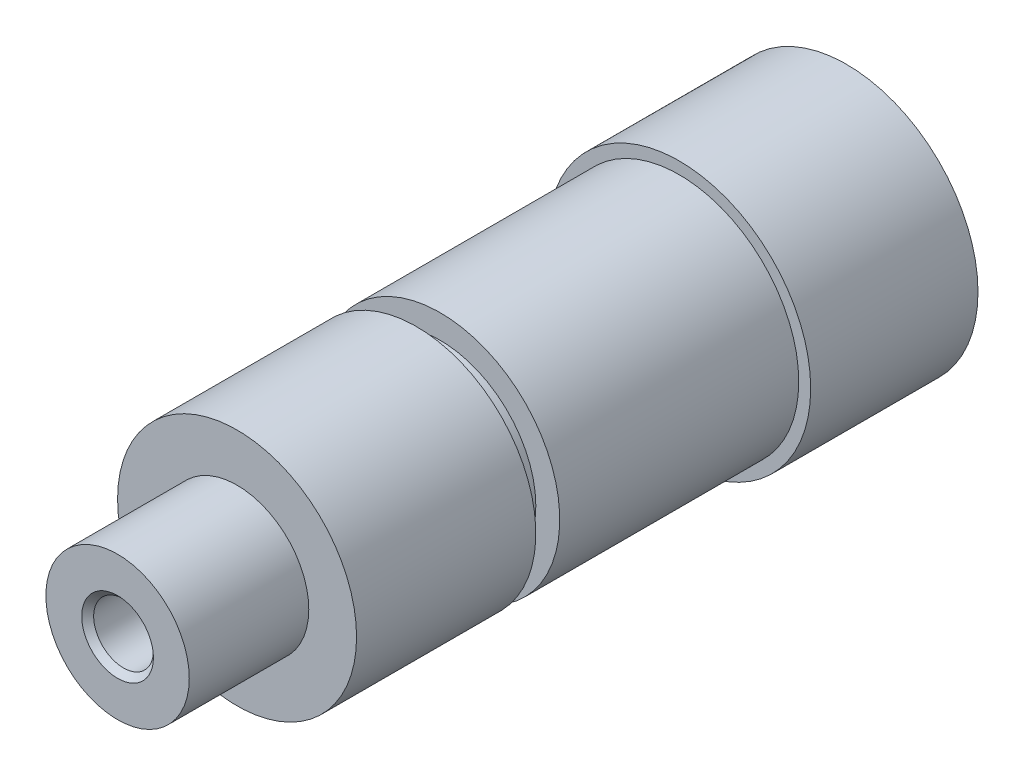
ISO-10303-21;
HEADER;
FILE_DESCRIPTION(('STEP AP214'),'2;1');
FILE_NAME('part.step','',(''),(''),'','','');
FILE_SCHEMA(('AUTOMOTIVE_DESIGN { 1 0 10303 214 1 1 1 1 }'));
ENDSEC;
DATA;
#1=APPLICATION_CONTEXT('core data for automotive mechanical design processes');
#2=APPLICATION_PROTOCOL_DEFINITION('international standard','automotive_design',2000,#1);
#3=PRODUCT_CONTEXT('',#1,'mechanical');
#4=PRODUCT('Part','Part','',(#3));
#5=PRODUCT_RELATED_PRODUCT_CATEGORY('part','',(#4));
#6=PRODUCT_DEFINITION_FORMATION('','',#4);
#7=PRODUCT_DEFINITION_CONTEXT('part definition',#1,'design');
#8=PRODUCT_DEFINITION('design','',#6,#7);
#9=PRODUCT_DEFINITION_SHAPE('','',#8);
#10=(LENGTH_UNIT() NAMED_UNIT(*) SI_UNIT(.MILLI.,.METRE.));
#11=(NAMED_UNIT(*) PLANE_ANGLE_UNIT() SI_UNIT($,.RADIAN.));
#12=(NAMED_UNIT(*) SI_UNIT($,.STERADIAN.) SOLID_ANGLE_UNIT());
#13=UNCERTAINTY_MEASURE_WITH_UNIT(LENGTH_MEASURE(1.E-05),#10,'distance_accuracy_value','');
#14=(GEOMETRIC_REPRESENTATION_CONTEXT(3) GLOBAL_UNCERTAINTY_ASSIGNED_CONTEXT((#13)) GLOBAL_UNIT_ASSIGNED_CONTEXT((#10,
#11,#12)) REPRESENTATION_CONTEXT('',''));
#15=CARTESIAN_POINT('',(0.,0.,0.));
#16=DIRECTION('',(0.,0.,1.));
#17=DIRECTION('',(1.,0.,0.));
#18=AXIS2_PLACEMENT_3D('',#15,#16,#17);
#19=CARTESIAN_POINT('',(0.,0.,51.));
#20=DIRECTION('',(0.,0.,1.));
#21=DIRECTION('',(1.,0.,0.));
#22=AXIS2_PLACEMENT_3D('',#19,#20,#21);
#23=PLANE('',#22);
#24=CARTESIAN_POINT('',(0.,0.,51.));
#25=DIRECTION('',(0.,0.,1.));
#26=DIRECTION('',(1.,0.,0.));
#27=AXIS2_PLACEMENT_3D('',#24,#25,#26);
#28=CIRCLE('',#27,10.);
#29=CARTESIAN_POINT('',(10.,0.,51.));
#30=VERTEX_POINT('',#29);
#31=EDGE_CURVE('E85',#30,#30,#28,.T.);
#32=ORIENTED_EDGE('',*,*,#31,.T.);
#33=EDGE_LOOP('',(#32));
#34=FACE_BOUND('',#33,.T.);
#35=CARTESIAN_POINT('',(0.,0.,51.));
#36=DIRECTION('',(0.,0.,1.));
#37=DIRECTION('',(1.,0.,0.));
#38=AXIS2_PLACEMENT_3D('',#35,#36,#37);
#39=CIRCLE('',#38,6.);
#40=CARTESIAN_POINT('',(6.,0.,51.));
#41=VERTEX_POINT('',#40);
#42=EDGE_CURVE('E64',#41,#41,#39,.T.);
#43=ORIENTED_EDGE('',*,*,#42,.F.);
#44=EDGE_LOOP('',(#43));
#45=FACE_BOUND('',#44,.T.);
#46=ADVANCED_FACE('F37',(#34,#45),#23,.T.);
#47=CARTESIAN_POINT('',(0.,0.,51.));
#48=DIRECTION('',(0.,0.,-1.));
#49=DIRECTION('',(-1.,0.,0.));
#50=AXIS2_PLACEMENT_3D('',#47,#48,#49);
#51=CYLINDRICAL_SURFACE('',#50,10.);
#52=CARTESIAN_POINT('',(0.,0.,14.));
#53=DIRECTION('',(0.,0.,1.));
#54=DIRECTION('',(1.,0.,0.));
#55=AXIS2_PLACEMENT_3D('',#52,#53,#54);
#56=CIRCLE('',#55,10.);
#57=CARTESIAN_POINT('',(10.,0.,14.));
#58=VERTEX_POINT('',#57);
#59=EDGE_CURVE('E82',#58,#58,#56,.T.);
#60=ORIENTED_EDGE('',*,*,#59,.T.);
#61=EDGE_LOOP('',(#60));
#62=FACE_BOUND('',#61,.T.);
#63=CARTESIAN_POINT('',(0.,0.,34.));
#64=DIRECTION('',(0.,0.,-1.));
#65=DIRECTION('',(-1.,0.,0.));
#66=AXIS2_PLACEMENT_3D('',#63,#64,#65);
#67=CIRCLE('',#66,10.);
#68=CARTESIAN_POINT('',(-10.,0.,34.));
#69=VERTEX_POINT('',#68);
#70=EDGE_CURVE('E79',#69,#69,#67,.T.);
#71=ORIENTED_EDGE('',*,*,#70,.T.);
#72=EDGE_LOOP('',(#71));
#73=FACE_BOUND('',#72,.T.);
#74=ADVANCED_FACE('F107',(#62,#73),#51,.T.);
#75=CARTESIAN_POINT('',(0.,0.,14.));
#76=DIRECTION('',(0.,0.,1.));
#77=DIRECTION('',(1.,0.,0.));
#78=AXIS2_PLACEMENT_3D('',#75,#76,#77);
#79=PLANE('',#78);
#80=CARTESIAN_POINT('',(0.,0.,14.));
#81=DIRECTION('',(0.,0.,1.));
#82=DIRECTION('',(1.,0.,0.));
#83=AXIS2_PLACEMENT_3D('',#80,#81,#82);
#84=CIRCLE('',#83,11.);
#85=CARTESIAN_POINT('',(11.,0.,14.));
#86=VERTEX_POINT('',#85);
#87=EDGE_CURVE('E11',#86,#86,#84,.T.);
#88=ORIENTED_EDGE('',*,*,#87,.T.);
#89=EDGE_LOOP('',(#88));
#90=FACE_BOUND('',#89,.T.);
#91=ORIENTED_EDGE('',*,*,#59,.F.);
#92=EDGE_LOOP('',(#91));
#93=FACE_BOUND('',#92,.T.);
#94=ADVANCED_FACE('F103',(#90,#93),#79,.T.);
#95=CARTESIAN_POINT('',(0.,0.,14.));
#96=DIRECTION('',(0.,0.,-1.));
#97=DIRECTION('',(-1.,0.,0.));
#98=AXIS2_PLACEMENT_3D('',#95,#96,#97);
#99=CYLINDRICAL_SURFACE('',#98,11.);
#100=ORIENTED_EDGE('',*,*,#87,.F.);
#101=EDGE_LOOP('',(#100));
#102=FACE_BOUND('',#101,.T.);
#103=CARTESIAN_POINT('',(0.,0.,0.));
#104=DIRECTION('',(0.,0.,1.));
#105=DIRECTION('',(1.,0.,0.));
#106=AXIS2_PLACEMENT_3D('',#103,#104,#105);
#107=CIRCLE('',#106,11.);
#108=CARTESIAN_POINT('',(11.,0.,0.));
#109=VERTEX_POINT('',#108);
#110=EDGE_CURVE('E44',#109,#109,#107,.T.);
#111=ORIENTED_EDGE('',*,*,#110,.T.);
#112=EDGE_LOOP('',(#111));
#113=FACE_BOUND('',#112,.T.);
#114=ADVANCED_FACE('F39',(#102,#113),#99,.T.);
#115=CARTESIAN_POINT('',(0.,0.,0.));
#116=DIRECTION('',(0.,0.,1.));
#117=DIRECTION('',(1.,0.,0.));
#118=AXIS2_PLACEMENT_3D('',#115,#116,#117);
#119=PLANE('',#118);
#120=ORIENTED_EDGE('',*,*,#110,.F.);
#121=EDGE_LOOP('',(#120));
#122=FACE_BOUND('',#121,.T.);
#123=ADVANCED_FACE('F92',(#122),#119,.F.);
#124=CARTESIAN_POINT('',(10.,0.,34.));
#125=DIRECTION('',(0.,0.,1.));
#126=DIRECTION('',(1.,0.,0.));
#127=AXIS2_PLACEMENT_3D('',#124,#125,#126);
#128=PLANE('',#127);
#129=CARTESIAN_POINT('',(0.,0.,34.));
#130=DIRECTION('',(0.,0.,-1.));
#131=DIRECTION('',(-1.,0.,0.));
#132=AXIS2_PLACEMENT_3D('',#129,#130,#131);
#133=CIRCLE('',#132,8.);
#134=CARTESIAN_POINT('',(-8.,0.,34.));
#135=VERTEX_POINT('',#134);
#136=EDGE_CURVE('E76',#135,#135,#133,.T.);
#137=ORIENTED_EDGE('',*,*,#136,.T.);
#138=EDGE_LOOP('',(#137));
#139=FACE_BOUND('',#138,.T.);
#140=ORIENTED_EDGE('',*,*,#70,.F.);
#141=EDGE_LOOP('',(#140));
#142=FACE_BOUND('',#141,.T.);
#143=ADVANCED_FACE('F94',(#139,#142),#128,.T.);
#144=CARTESIAN_POINT('',(0.,0.,0.));
#145=DIRECTION('',(0.,0.,-1.));
#146=DIRECTION('',(-1.,0.,0.));
#147=AXIS2_PLACEMENT_3D('',#144,#145,#146);
#148=CYLINDRICAL_SURFACE('',#147,8.);
#149=CARTESIAN_POINT('',(0.,0.,36.));
#150=DIRECTION('',(0.,0.,-1.));
#151=DIRECTION('',(-1.,0.,0.));
#152=AXIS2_PLACEMENT_3D('',#149,#150,#151);
#153=CIRCLE('',#152,8.);
#154=CARTESIAN_POINT('',(-8.,0.,36.));
#155=VERTEX_POINT('',#154);
#156=EDGE_CURVE('E73',#155,#155,#153,.T.);
#157=ORIENTED_EDGE('',*,*,#156,.T.);
#158=EDGE_LOOP('',(#157));
#159=FACE_BOUND('',#158,.T.);
#160=ORIENTED_EDGE('',*,*,#136,.F.);
#161=EDGE_LOOP('',(#160));
#162=FACE_BOUND('',#161,.T.);
#163=ADVANCED_FACE('F100',(#159,#162),#148,.T.);
#164=CARTESIAN_POINT('',(8.,0.,36.));
#165=DIRECTION('',(0.,0.,-1.));
#166=DIRECTION('',(-1.,0.,0.));
#167=AXIS2_PLACEMENT_3D('',#164,#165,#166);
#168=PLANE('',#167);
#169=CARTESIAN_POINT('',(0.,0.,36.));
#170=DIRECTION('',(0.,0.,-1.));
#171=DIRECTION('',(-1.,0.,0.));
#172=AXIS2_PLACEMENT_3D('',#169,#170,#171);
#173=CIRCLE('',#172,10.);
#174=CARTESIAN_POINT('',(-10.,0.,36.));
#175=VERTEX_POINT('',#174);
#176=EDGE_CURVE('E70',#175,#175,#173,.T.);
#177=ORIENTED_EDGE('',*,*,#176,.T.);
#178=EDGE_LOOP('',(#177));
#179=FACE_BOUND('',#178,.T.);
#180=ORIENTED_EDGE('',*,*,#156,.F.);
#181=EDGE_LOOP('',(#180));
#182=FACE_BOUND('',#181,.T.);
#183=ADVANCED_FACE('F119',(#179,#182),#168,.T.);
#184=ORIENTED_EDGE('',*,*,#31,.F.);
#185=EDGE_LOOP('',(#184));
#186=FACE_BOUND('',#185,.T.);
#187=ORIENTED_EDGE('',*,*,#176,.F.);
#188=EDGE_LOOP('',(#187));
#189=FACE_BOUND('',#188,.T.);
#190=ADVANCED_FACE('F114',(#186,#189),#51,.T.);
#191=CARTESIAN_POINT('',(0.,0.,61.));
#192=DIRECTION('',(0.,0.,-1.));
#193=DIRECTION('',(-1.,0.,0.));
#194=AXIS2_PLACEMENT_3D('',#191,#192,#193);
#195=CYLINDRICAL_SURFACE('',#194,6.);
#196=CARTESIAN_POINT('',(0.,0.,61.));
#197=DIRECTION('',(0.,0.,1.));
#198=DIRECTION('',(1.,0.,0.));
#199=AXIS2_PLACEMENT_3D('',#196,#197,#198);
#200=CIRCLE('',#199,6.);
#201=CARTESIAN_POINT('',(6.,0.,61.));
#202=VERTEX_POINT('',#201);
#203=EDGE_CURVE('E67',#202,#202,#200,.T.);
#204=ORIENTED_EDGE('',*,*,#203,.F.);
#205=EDGE_LOOP('',(#204));
#206=FACE_BOUND('',#205,.T.);
#207=ORIENTED_EDGE('',*,*,#42,.T.);
#208=EDGE_LOOP('',(#207));
#209=FACE_BOUND('',#208,.T.);
#210=ADVANCED_FACE('F124',(#206,#209),#195,.T.);
#211=CARTESIAN_POINT('',(0.,0.,61.));
#212=DIRECTION('',(0.,0.,1.));
#213=DIRECTION('',(1.,0.,0.));
#214=AXIS2_PLACEMENT_3D('',#211,#212,#213);
#215=PLANE('',#214);
#216=CARTESIAN_POINT('',(0.,0.,61.));
#217=DIRECTION('',(0.,0.,1.));
#218=DIRECTION('',(1.,0.,0.));
#219=AXIS2_PLACEMENT_3D('',#216,#217,#218);
#220=CIRCLE('',#219,3.);
#221=CARTESIAN_POINT('',(3.,0.,61.));
#222=VERTEX_POINT('',#221);
#223=EDGE_CURVE('E59',#222,#222,#220,.T.);
#224=ORIENTED_EDGE('',*,*,#223,.F.);
#225=EDGE_LOOP('',(#224));
#226=FACE_BOUND('',#225,.T.);
#227=ORIENTED_EDGE('',*,*,#203,.T.);
#228=EDGE_LOOP('',(#227));
#229=FACE_BOUND('',#228,.T.);
#230=ADVANCED_FACE('F127',(#226,#229),#215,.T.);
#231=CARTESIAN_POINT('',(0.,0.,61.));
#232=DIRECTION('',(0.,0.,1.));
#233=DIRECTION('',(1.,0.,0.));
#234=AXIS2_PLACEMENT_3D('',#231,#232,#233);
#235=CONICAL_SURFACE('',#234,3.,0.785398163397451);
#236=CARTESIAN_POINT('',(0.,0.,60.5));
#237=DIRECTION('',(0.,0.,1.));
#238=DIRECTION('',(1.,0.,0.));
#239=AXIS2_PLACEMENT_3D('',#236,#237,#238);
#240=CIRCLE('',#239,2.5);
#241=CARTESIAN_POINT('',(2.5,0.,60.5));
#242=VERTEX_POINT('',#241);
#243=EDGE_CURVE('E56',#242,#242,#240,.T.);
#244=ORIENTED_EDGE('',*,*,#243,.F.);
#245=EDGE_LOOP('',(#244));
#246=FACE_BOUND('',#245,.T.);
#247=ORIENTED_EDGE('',*,*,#223,.T.);
#248=EDGE_LOOP('',(#247));
#249=FACE_BOUND('',#248,.T.);
#250=ADVANCED_FACE('F131',(#246,#249),#235,.F.);
#251=CARTESIAN_POINT('',(0.,0.,61.));
#252=DIRECTION('',(0.,0.,1.));
#253=DIRECTION('',(1.,0.,0.));
#254=AXIS2_PLACEMENT_3D('',#251,#252,#253);
#255=CYLINDRICAL_SURFACE('',#254,2.5);
#256=CARTESIAN_POINT('',(0.,0.,42.));
#257=DIRECTION('',(0.,0.,1.));
#258=DIRECTION('',(1.,0.,0.));
#259=AXIS2_PLACEMENT_3D('',#256,#257,#258);
#260=CIRCLE('',#259,2.5);
#261=CARTESIAN_POINT('',(2.5,0.,42.));
#262=VERTEX_POINT('',#261);
#263=EDGE_CURVE('E54',#262,#262,#260,.T.);
#264=ORIENTED_EDGE('',*,*,#263,.F.);
#265=EDGE_LOOP('',(#264));
#266=FACE_BOUND('',#265,.T.);
#267=ORIENTED_EDGE('',*,*,#243,.T.);
#268=EDGE_LOOP('',(#267));
#269=FACE_BOUND('',#268,.T.);
#270=ADVANCED_FACE('F50',(#266,#269),#255,.F.);
#271=CARTESIAN_POINT('',(0.,0.,42.));
#272=DIRECTION('',(0.,0.,1.));
#273=DIRECTION('',(1.,0.,0.));
#274=AXIS2_PLACEMENT_3D('',#271,#272,#273);
#275=CONICAL_SURFACE('',#274,2.5,1.02974425867665);
#276=CARTESIAN_POINT('',(0.,0.,40.4978484524311));
#277=VERTEX_POINT('',#276);
#278=VERTEX_LOOP('',#277);
#279=FACE_BOUND('',#278,.T.);
#280=ORIENTED_EDGE('',*,*,#263,.T.);
#281=EDGE_LOOP('',(#280));
#282=FACE_BOUND('',#281,.T.);
#283=ADVANCED_FACE('F47',(#279,#282),#275,.F.);
#284=CLOSED_SHELL('',(#46,#74,#94,#114,#123,#143,#163,#183,#190,#210,#230,#250,#270,#283));
#285=MANIFOLD_SOLID_BREP('B2',#284);
#286=ADVANCED_BREP_SHAPE_REPRESENTATION('',(#18,#285),#14);
#287=SHAPE_DEFINITION_REPRESENTATION(#9,#286);
ENDSEC;
END-ISO-10303-21;
